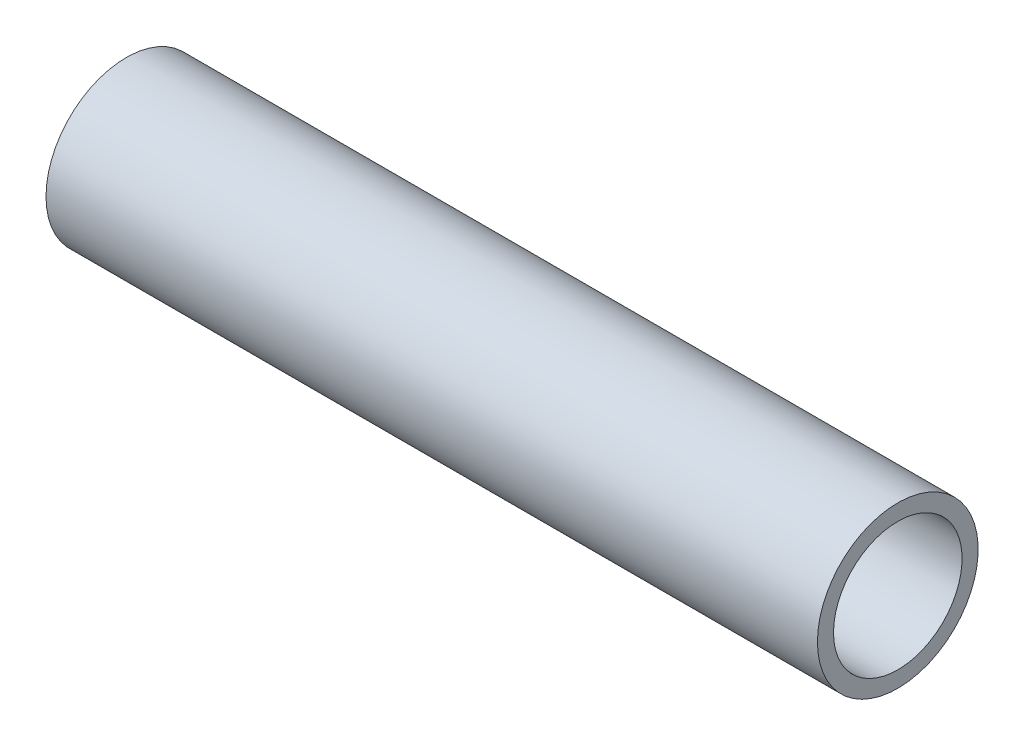
ISO-10303-21;
HEADER;
FILE_DESCRIPTION(('STEP AP214'),'2;1');
FILE_NAME('part.step','',(''),(''),'','','');
FILE_SCHEMA(('AUTOMOTIVE_DESIGN { 1 0 10303 214 1 1 1 1 }'));
ENDSEC;
DATA;
#1=APPLICATION_CONTEXT('core data for automotive mechanical design processes');
#2=APPLICATION_PROTOCOL_DEFINITION('international standard','automotive_design',2000,#1);
#3=PRODUCT_CONTEXT('',#1,'mechanical');
#4=PRODUCT('Part','Part','',(#3));
#5=PRODUCT_RELATED_PRODUCT_CATEGORY('part','',(#4));
#6=PRODUCT_DEFINITION_FORMATION('','',#4);
#7=PRODUCT_DEFINITION_CONTEXT('part definition',#1,'design');
#8=PRODUCT_DEFINITION('design','',#6,#7);
#9=PRODUCT_DEFINITION_SHAPE('','',#8);
#10=(LENGTH_UNIT() NAMED_UNIT(*) SI_UNIT(.MILLI.,.METRE.));
#11=(NAMED_UNIT(*) PLANE_ANGLE_UNIT() SI_UNIT($,.RADIAN.));
#12=(NAMED_UNIT(*) SI_UNIT($,.STERADIAN.) SOLID_ANGLE_UNIT());
#13=UNCERTAINTY_MEASURE_WITH_UNIT(LENGTH_MEASURE(1.E-05),#10,'distance_accuracy_value','');
#14=(GEOMETRIC_REPRESENTATION_CONTEXT(3) GLOBAL_UNCERTAINTY_ASSIGNED_CONTEXT((#13)) GLOBAL_UNIT_ASSIGNED_CONTEXT((#10,
#11,#12)) REPRESENTATION_CONTEXT('',''));
#15=CARTESIAN_POINT('',(0.,0.,0.));
#16=DIRECTION('',(0.,0.,1.));
#17=DIRECTION('',(1.,0.,0.));
#18=AXIS2_PLACEMENT_3D('',#15,#16,#17);
#19=CARTESIAN_POINT('',(76.2,0.,0.));
#20=DIRECTION('',(1.,0.,0.));
#21=DIRECTION('',(0.,0.,-1.));
#22=AXIS2_PLACEMENT_3D('',#19,#20,#21);
#23=PLANE('',#22);
#24=CARTESIAN_POINT('',(76.2,0.,0.));
#25=DIRECTION('',(1.,0.,0.));
#26=DIRECTION('',(0.,0.,-1.));
#27=AXIS2_PLACEMENT_3D('',#24,#25,#26);
#28=CIRCLE('',#27,7.9375);
#29=CARTESIAN_POINT('',(76.2,0.,7.9375));
#30=VERTEX_POINT('',#29);
#31=EDGE_CURVE('E10',#30,#30,#28,.T.);
#32=ORIENTED_EDGE('',*,*,#31,.T.);
#33=EDGE_LOOP('',(#32));
#34=FACE_BOUND('',#33,.T.);
#35=CARTESIAN_POINT('',(76.2,0.,0.));
#36=DIRECTION('',(1.,0.,0.));
#37=DIRECTION('',(0.,0.,-1.));
#38=AXIS2_PLACEMENT_3D('',#35,#36,#37);
#39=CIRCLE('',#38,6.35);
#40=CARTESIAN_POINT('',(76.2,0.,6.35));
#41=VERTEX_POINT('',#40);
#42=EDGE_CURVE('E41',#41,#41,#39,.T.);
#43=ORIENTED_EDGE('',*,*,#42,.F.);
#44=EDGE_LOOP('',(#43));
#45=FACE_BOUND('',#44,.T.);
#46=ADVANCED_FACE('F30',(#34,#45),#23,.T.);
#47=CARTESIAN_POINT('',(0.,0.,0.));
#48=DIRECTION('',(1.,0.,0.));
#49=DIRECTION('',(0.,0.,-1.));
#50=AXIS2_PLACEMENT_3D('',#47,#48,#49);
#51=PLANE('',#50);
#52=CARTESIAN_POINT('',(0.,0.,0.));
#53=DIRECTION('',(1.,0.,0.));
#54=DIRECTION('',(0.,0.,-1.));
#55=AXIS2_PLACEMENT_3D('',#52,#53,#54);
#56=CIRCLE('',#55,7.9375);
#57=CARTESIAN_POINT('',(0.,0.,7.9375));
#58=VERTEX_POINT('',#57);
#59=EDGE_CURVE('E34',#58,#58,#56,.T.);
#60=ORIENTED_EDGE('',*,*,#59,.F.);
#61=EDGE_LOOP('',(#60));
#62=FACE_BOUND('',#61,.T.);
#63=CARTESIAN_POINT('',(0.,0.,0.));
#64=DIRECTION('',(1.,0.,0.));
#65=DIRECTION('',(0.,0.,-1.));
#66=AXIS2_PLACEMENT_3D('',#63,#64,#65);
#67=CIRCLE('',#66,6.35);
#68=CARTESIAN_POINT('',(0.,0.,6.35));
#69=VERTEX_POINT('',#68);
#70=EDGE_CURVE('E43',#69,#69,#67,.T.);
#71=ORIENTED_EDGE('',*,*,#70,.T.);
#72=EDGE_LOOP('',(#71));
#73=FACE_BOUND('',#72,.T.);
#74=ADVANCED_FACE('F53',(#62,#73),#51,.F.);
#75=CARTESIAN_POINT('',(76.2,0.,0.));
#76=DIRECTION('',(-1.,0.,0.));
#77=DIRECTION('',(0.,0.,1.));
#78=AXIS2_PLACEMENT_3D('',#75,#76,#77);
#79=CYLINDRICAL_SURFACE('',#78,7.9375);
#80=CARTESIAN_POINT('',(76.2,0.,7.9375));
#81=CARTESIAN_POINT('',(75.40625,0.,7.9375));
#82=CARTESIAN_POINT('',(74.6125,0.,7.9375));
#83=CARTESIAN_POINT('',(73.025,0.,7.9375));
#84=CARTESIAN_POINT('',(72.23125,0.,7.9375));
#85=CARTESIAN_POINT('',(70.64375,0.,7.9375));
#86=CARTESIAN_POINT('',(69.85,0.,7.9375));
#87=CARTESIAN_POINT('',(68.2625,0.,7.9375));
#88=CARTESIAN_POINT('',(67.46875,0.,7.9375));
#89=CARTESIAN_POINT('',(65.88125,0.,7.9375));
#90=CARTESIAN_POINT('',(65.0875,0.,7.9375));
#91=CARTESIAN_POINT('',(63.5,0.,7.9375));
#92=CARTESIAN_POINT('',(62.70625,0.,7.9375));
#93=CARTESIAN_POINT('',(61.11875,0.,7.9375));
#94=CARTESIAN_POINT('',(60.325,0.,7.9375));
#95=CARTESIAN_POINT('',(58.7375,0.,7.9375));
#96=CARTESIAN_POINT('',(57.94375,0.,7.9375));
#97=CARTESIAN_POINT('',(56.35625,0.,7.9375));
#98=CARTESIAN_POINT('',(55.5625,0.,7.9375));
#99=CARTESIAN_POINT('',(53.975,0.,7.9375));
#100=CARTESIAN_POINT('',(53.18125,0.,7.9375));
#101=CARTESIAN_POINT('',(51.59375,0.,7.9375));
#102=CARTESIAN_POINT('',(50.8,0.,7.9375));
#103=CARTESIAN_POINT('',(49.2125,0.,7.9375));
#104=CARTESIAN_POINT('',(48.41875,0.,7.9375));
#105=CARTESIAN_POINT('',(46.83125,0.,7.9375));
#106=CARTESIAN_POINT('',(46.0375,0.,7.9375));
#107=CARTESIAN_POINT('',(44.45,0.,7.9375));
#108=CARTESIAN_POINT('',(43.65625,0.,7.9375));
#109=CARTESIAN_POINT('',(42.06875,0.,7.9375));
#110=CARTESIAN_POINT('',(41.275,0.,7.9375));
#111=CARTESIAN_POINT('',(39.6875,0.,7.9375));
#112=CARTESIAN_POINT('',(38.89375,0.,7.9375));
#113=CARTESIAN_POINT('',(37.30625,0.,7.9375));
#114=CARTESIAN_POINT('',(36.5125,0.,7.9375));
#115=CARTESIAN_POINT('',(34.925,0.,7.9375));
#116=CARTESIAN_POINT('',(34.13125,0.,7.9375));
#117=CARTESIAN_POINT('',(32.54375,0.,7.9375));
#118=CARTESIAN_POINT('',(31.75,0.,7.9375));
#119=CARTESIAN_POINT('',(30.1625,0.,7.9375));
#120=CARTESIAN_POINT('',(29.36875,0.,7.9375));
#121=CARTESIAN_POINT('',(27.78125,0.,7.9375));
#122=CARTESIAN_POINT('',(26.9875,0.,7.9375));
#123=CARTESIAN_POINT('',(25.4,0.,7.9375));
#124=CARTESIAN_POINT('',(24.60625,0.,7.9375));
#125=CARTESIAN_POINT('',(23.01875,0.,7.9375));
#126=CARTESIAN_POINT('',(22.225,0.,7.9375));
#127=CARTESIAN_POINT('',(20.6375,0.,7.9375));
#128=CARTESIAN_POINT('',(19.84375,0.,7.9375));
#129=CARTESIAN_POINT('',(18.25625,0.,7.9375));
#130=CARTESIAN_POINT('',(17.4625,0.,7.9375));
#131=CARTESIAN_POINT('',(15.875,0.,7.9375));
#132=CARTESIAN_POINT('',(15.08125,0.,7.9375));
#133=CARTESIAN_POINT('',(13.49375,0.,7.9375));
#134=CARTESIAN_POINT('',(12.7,0.,7.9375));
#135=CARTESIAN_POINT('',(11.1125,0.,7.9375));
#136=CARTESIAN_POINT('',(10.31875,0.,7.9375));
#137=CARTESIAN_POINT('',(8.73125,0.,7.9375));
#138=CARTESIAN_POINT('',(7.93750000000001,0.,7.9375));
#139=CARTESIAN_POINT('',(6.35,0.,7.9375));
#140=CARTESIAN_POINT('',(5.55625,0.,7.9375));
#141=CARTESIAN_POINT('',(3.96875,0.,7.9375));
#142=CARTESIAN_POINT('',(3.175,0.,7.9375));
#143=CARTESIAN_POINT('',(1.5875,0.,7.9375));
#144=CARTESIAN_POINT('',(0.793750000000001,0.,7.9375));
#145=CARTESIAN_POINT('',(0.,0.,7.9375));
#146=B_SPLINE_CURVE_WITH_KNOTS('',3,(#80,#81,#82,#83,#84,#85,#86,#87,#88,#89,#90,#91,#92,#93,
#94,#95,#96,#97,#98,#99,#100,#101,#102,#103,#104,#105,#106,#107,#108,#109,#110,#111,#112,#113,
#114,#115,#116,#117,#118,#119,#120,#121,#122,#123,#124,#125,#126,#127,#128,#129,#130,#131,#132,
#133,#134,#135,#136,#137,#138,#139,#140,#141,#142,#143,#144,#145),.UNSPECIFIED.,.F.,.F.,(4,2,2,
2,2,2,2,2,2,2,2,2,2,2,2,2,2,2,2,2,2,2,2,2,2,2,2,2,2,2,2,2,4),(0.,2.38124999999999,
4.76249999999999,7.14374999999999,9.52499999999999,11.90625,14.2875,16.66875,19.05,21.43125,
23.8125,26.19375,28.575,30.95625,33.3375,35.71875,38.1,40.48125,42.8625,45.24375,47.625,
50.00625,52.3875,54.76875,57.15,59.53125,61.9125,64.29375,66.675,69.05625,71.4375,73.81875,
76.2),.UNSPECIFIED.);
#147=EDGE_CURVE('BSEAM32',#30,#58,#146,.T.);
#148=ORIENTED_EDGE('',*,*,#31,.F.);
#149=ORIENTED_EDGE('',*,*,#59,.T.);
#150=ORIENTED_EDGE('',*,*,#147,.T.);
#151=ORIENTED_EDGE('',*,*,#147,.F.);
#152=EDGE_LOOP('',(#148,#150,#149,#151));
#153=FACE_BOUND('',#152,.T.);
#154=ADVANCED_FACE('F32',(#153),#79,.T.);
#155=CARTESIAN_POINT('',(76.2,0.,0.));
#156=DIRECTION('',(-1.,0.,0.));
#157=DIRECTION('',(0.,0.,1.));
#158=AXIS2_PLACEMENT_3D('',#155,#156,#157);
#159=CYLINDRICAL_SURFACE('',#158,6.35);
#160=CARTESIAN_POINT('',(76.2,0.,6.35));
#161=CARTESIAN_POINT('',(75.40625,0.,6.35));
#162=CARTESIAN_POINT('',(74.6125,0.,6.35));
#163=CARTESIAN_POINT('',(73.025,0.,6.35));
#164=CARTESIAN_POINT('',(72.23125,0.,6.35));
#165=CARTESIAN_POINT('',(70.64375,0.,6.35));
#166=CARTESIAN_POINT('',(69.85,0.,6.35));
#167=CARTESIAN_POINT('',(68.2625,0.,6.35));
#168=CARTESIAN_POINT('',(67.46875,0.,6.35));
#169=CARTESIAN_POINT('',(65.88125,0.,6.35));
#170=CARTESIAN_POINT('',(65.0875,0.,6.35));
#171=CARTESIAN_POINT('',(63.5,0.,6.35));
#172=CARTESIAN_POINT('',(62.70625,0.,6.35));
#173=CARTESIAN_POINT('',(61.11875,0.,6.35));
#174=CARTESIAN_POINT('',(60.325,0.,6.35));
#175=CARTESIAN_POINT('',(58.7375,0.,6.35));
#176=CARTESIAN_POINT('',(57.94375,0.,6.35));
#177=CARTESIAN_POINT('',(56.35625,0.,6.35));
#178=CARTESIAN_POINT('',(55.5625,0.,6.35));
#179=CARTESIAN_POINT('',(53.975,0.,6.35));
#180=CARTESIAN_POINT('',(53.18125,0.,6.35));
#181=CARTESIAN_POINT('',(51.59375,0.,6.35));
#182=CARTESIAN_POINT('',(50.8,0.,6.35));
#183=CARTESIAN_POINT('',(49.2125,0.,6.35));
#184=CARTESIAN_POINT('',(48.41875,0.,6.35));
#185=CARTESIAN_POINT('',(46.83125,0.,6.35));
#186=CARTESIAN_POINT('',(46.0375,0.,6.35));
#187=CARTESIAN_POINT('',(44.45,0.,6.35));
#188=CARTESIAN_POINT('',(43.65625,0.,6.35));
#189=CARTESIAN_POINT('',(42.06875,0.,6.35));
#190=CARTESIAN_POINT('',(41.275,0.,6.35));
#191=CARTESIAN_POINT('',(39.6875,0.,6.35));
#192=CARTESIAN_POINT('',(38.89375,0.,6.35));
#193=CARTESIAN_POINT('',(37.30625,0.,6.35));
#194=CARTESIAN_POINT('',(36.5125,0.,6.35));
#195=CARTESIAN_POINT('',(34.925,0.,6.35));
#196=CARTESIAN_POINT('',(34.13125,0.,6.35));
#197=CARTESIAN_POINT('',(32.54375,0.,6.35));
#198=CARTESIAN_POINT('',(31.75,0.,6.35));
#199=CARTESIAN_POINT('',(30.1625,0.,6.35));
#200=CARTESIAN_POINT('',(29.36875,0.,6.35));
#201=CARTESIAN_POINT('',(27.78125,0.,6.35));
#202=CARTESIAN_POINT('',(26.9875,0.,6.35));
#203=CARTESIAN_POINT('',(25.4,0.,6.35));
#204=CARTESIAN_POINT('',(24.60625,0.,6.35));
#205=CARTESIAN_POINT('',(23.01875,0.,6.35));
#206=CARTESIAN_POINT('',(22.225,0.,6.35));
#207=CARTESIAN_POINT('',(20.6375,0.,6.35));
#208=CARTESIAN_POINT('',(19.84375,0.,6.35));
#209=CARTESIAN_POINT('',(18.25625,0.,6.35));
#210=CARTESIAN_POINT('',(17.4625,0.,6.35));
#211=CARTESIAN_POINT('',(15.875,0.,6.35));
#212=CARTESIAN_POINT('',(15.08125,0.,6.35));
#213=CARTESIAN_POINT('',(13.49375,0.,6.35));
#214=CARTESIAN_POINT('',(12.7,0.,6.35));
#215=CARTESIAN_POINT('',(11.1125,0.,6.35));
#216=CARTESIAN_POINT('',(10.31875,0.,6.35));
#217=CARTESIAN_POINT('',(8.73125,0.,6.35));
#218=CARTESIAN_POINT('',(7.93750000000001,0.,6.35));
#219=CARTESIAN_POINT('',(6.35,0.,6.35));
#220=CARTESIAN_POINT('',(5.55625,0.,6.35));
#221=CARTESIAN_POINT('',(3.96875,0.,6.35));
#222=CARTESIAN_POINT('',(3.175,0.,6.35));
#223=CARTESIAN_POINT('',(1.5875,0.,6.35));
#224=CARTESIAN_POINT('',(0.793750000000001,0.,6.35));
#225=CARTESIAN_POINT('',(0.,0.,6.35));
#226=B_SPLINE_CURVE_WITH_KNOTS('',3,(#160,#161,#162,#163,#164,#165,#166,#167,#168,#169,#170,
#171,#172,#173,#174,#175,#176,#177,#178,#179,#180,#181,#182,#183,#184,#185,#186,#187,#188,#189,
#190,#191,#192,#193,#194,#195,#196,#197,#198,#199,#200,#201,#202,#203,#204,#205,#206,#207,#208,
#209,#210,#211,#212,#213,#214,#215,#216,#217,#218,#219,#220,#221,#222,#223,#224,#225),
.UNSPECIFIED.,.F.,.F.,(4,2,2,2,2,2,2,2,2,2,2,2,2,2,2,2,2,2,2,2,2,2,2,2,2,2,2,2,2,2,2,2,4),(0.,
2.38124999999999,4.76249999999999,7.14374999999999,9.52499999999999,11.90625,14.2875,16.66875,
19.05,21.43125,23.8125,26.19375,28.575,30.95625,33.3375,35.71875,38.1,40.48125,42.8625,45.24375,
47.625,50.00625,52.3875,54.76875,57.15,59.53125,61.9125,64.29375,66.675,69.05625,71.4375,
73.81875,76.2),.UNSPECIFIED.);
#227=EDGE_CURVE('BSEAM49',#41,#69,#226,.T.);
#228=ORIENTED_EDGE('',*,*,#42,.T.);
#229=ORIENTED_EDGE('',*,*,#70,.F.);
#230=ORIENTED_EDGE('',*,*,#227,.T.);
#231=ORIENTED_EDGE('',*,*,#227,.F.);
#232=EDGE_LOOP('',(#228,#230,#229,#231));
#233=FACE_BOUND('',#232,.T.);
#234=ADVANCED_FACE('F49',(#233),#159,.F.);
#235=CLOSED_SHELL('',(#46,#74,#154,#234));
#236=MANIFOLD_SOLID_BREP('B2',#235);
#237=ADVANCED_BREP_SHAPE_REPRESENTATION('',(#18,#236),#14);
#238=SHAPE_DEFINITION_REPRESENTATION(#9,#237);
ENDSEC;
END-ISO-10303-21;
